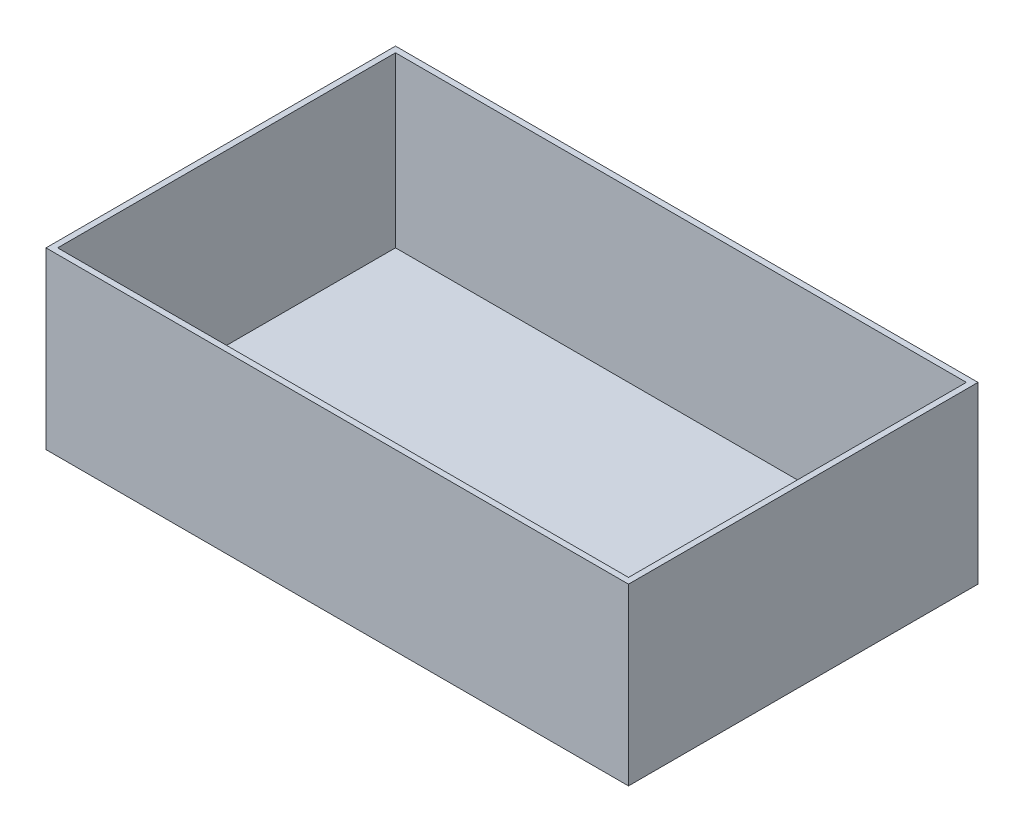
ISO-10303-21;
HEADER;
FILE_DESCRIPTION(('STEP AP214'),'2;1');
FILE_NAME('part.step','',(''),(''),'','','');
FILE_SCHEMA(('AUTOMOTIVE_DESIGN { 1 0 10303 214 1 1 1 1 }'));
ENDSEC;
DATA;
#1=APPLICATION_CONTEXT('core data for automotive mechanical design processes');
#2=APPLICATION_PROTOCOL_DEFINITION('international standard','automotive_design',2000,#1);
#3=PRODUCT_CONTEXT('',#1,'mechanical');
#4=PRODUCT('Part','Part','',(#3));
#5=PRODUCT_RELATED_PRODUCT_CATEGORY('part','',(#4));
#6=PRODUCT_DEFINITION_FORMATION('','',#4);
#7=PRODUCT_DEFINITION_CONTEXT('part definition',#1,'design');
#8=PRODUCT_DEFINITION('design','',#6,#7);
#9=PRODUCT_DEFINITION_SHAPE('','',#8);
#10=(LENGTH_UNIT() NAMED_UNIT(*) SI_UNIT(.MILLI.,.METRE.));
#11=(NAMED_UNIT(*) PLANE_ANGLE_UNIT() SI_UNIT($,.RADIAN.));
#12=(NAMED_UNIT(*) SI_UNIT($,.STERADIAN.) SOLID_ANGLE_UNIT());
#13=UNCERTAINTY_MEASURE_WITH_UNIT(LENGTH_MEASURE(1.E-05),#10,'distance_accuracy_value','');
#14=(GEOMETRIC_REPRESENTATION_CONTEXT(3) GLOBAL_UNCERTAINTY_ASSIGNED_CONTEXT((#13)) GLOBAL_UNIT_ASSIGNED_CONTEXT((#10,
#11,#12)) REPRESENTATION_CONTEXT('',''));
#15=CARTESIAN_POINT('',(0.,0.,0.));
#16=DIRECTION('',(0.,0.,1.));
#17=DIRECTION('',(1.,0.,0.));
#18=AXIS2_PLACEMENT_3D('',#15,#16,#17);
#19=CARTESIAN_POINT('',(250.,5.,150.));
#20=DIRECTION('',(-1.,0.,0.));
#21=DIRECTION('',(0.,0.,1.));
#22=AXIS2_PLACEMENT_3D('',#19,#20,#21);
#23=PLANE('',#22);
#24=DIRECTION('',(0.,0.,-1.));
#25=VECTOR('',#24,1.);
#26=CARTESIAN_POINT('',(250.,0.,150.));
#27=LINE('',#26,#25);
#28=CARTESIAN_POINT('',(250.,0.,150.));
#29=VERTEX_POINT('',#28);
#30=CARTESIAN_POINT('',(250.,0.,-150.));
#31=VERTEX_POINT('',#30);
#32=EDGE_CURVE('E173',#29,#31,#27,.T.);
#33=ORIENTED_EDGE('',*,*,#32,.T.);
#34=DIRECTION('',(0.,-1.,0.));
#35=VECTOR('',#34,1.);
#36=CARTESIAN_POINT('',(250.,5.,-150.));
#37=LINE('',#36,#35);
#38=CARTESIAN_POINT('',(250.,150.,-150.));
#39=VERTEX_POINT('',#38);
#40=EDGE_CURVE('E11',#39,#31,#37,.T.);
#41=ORIENTED_EDGE('',*,*,#40,.F.);
#42=DIRECTION('',(0.,0.,-1.));
#43=VECTOR('',#42,1.);
#44=CARTESIAN_POINT('',(250.,150.,150.));
#45=LINE('',#44,#43);
#46=CARTESIAN_POINT('',(250.,150.,150.));
#47=VERTEX_POINT('',#46);
#48=EDGE_CURVE('E161',#47,#39,#45,.T.);
#49=ORIENTED_EDGE('',*,*,#48,.F.);
#50=DIRECTION('',(0.,-1.,0.));
#51=VECTOR('',#50,1.);
#52=CARTESIAN_POINT('',(250.,5.,150.));
#53=LINE('',#52,#51);
#54=EDGE_CURVE('E185',#47,#29,#53,.T.);
#55=ORIENTED_EDGE('',*,*,#54,.T.);
#56=EDGE_LOOP('',(#33,#41,#49,#55));
#57=FACE_BOUND('',#56,.T.);
#58=ADVANCED_FACE('F39',(#57),#23,.F.);
#59=CARTESIAN_POINT('',(-250.,5.,-150.));
#60=DIRECTION('',(0.,0.,1.));
#61=DIRECTION('',(1.,0.,0.));
#62=AXIS2_PLACEMENT_3D('',#59,#60,#61);
#63=PLANE('',#62);
#64=DIRECTION('',(-1.,0.,0.));
#65=VECTOR('',#64,1.);
#66=CARTESIAN_POINT('',(-250.,0.,-150.));
#67=LINE('',#66,#65);
#68=CARTESIAN_POINT('',(-250.,0.,-150.));
#69=VERTEX_POINT('',#68);
#70=EDGE_CURVE('E177',#31,#69,#67,.T.);
#71=ORIENTED_EDGE('',*,*,#70,.T.);
#72=DIRECTION('',(0.,-1.,0.));
#73=VECTOR('',#72,1.);
#74=CARTESIAN_POINT('',(-250.,5.,-150.));
#75=LINE('',#74,#73);
#76=CARTESIAN_POINT('',(-250.,150.,-150.));
#77=VERTEX_POINT('',#76);
#78=EDGE_CURVE('E47',#77,#69,#75,.T.);
#79=ORIENTED_EDGE('',*,*,#78,.F.);
#80=DIRECTION('',(-1.,0.,0.));
#81=VECTOR('',#80,1.);
#82=CARTESIAN_POINT('',(250.,150.,-150.));
#83=LINE('',#82,#81);
#84=EDGE_CURVE('E165',#39,#77,#83,.T.);
#85=ORIENTED_EDGE('',*,*,#84,.F.);
#86=ORIENTED_EDGE('',*,*,#40,.T.);
#87=EDGE_LOOP('',(#71,#79,#85,#86));
#88=FACE_BOUND('',#87,.T.);
#89=ADVANCED_FACE('F206',(#88),#63,.F.);
#90=CARTESIAN_POINT('',(-250.,5.,150.));
#91=DIRECTION('',(1.,0.,0.));
#92=DIRECTION('',(0.,0.,-1.));
#93=AXIS2_PLACEMENT_3D('',#90,#91,#92);
#94=PLANE('',#93);
#95=DIRECTION('',(0.,0.,1.));
#96=VECTOR('',#95,1.);
#97=CARTESIAN_POINT('',(-250.,0.,150.));
#98=LINE('',#97,#96);
#99=CARTESIAN_POINT('',(-250.,0.,150.));
#100=VERTEX_POINT('',#99);
#101=EDGE_CURVE('E180',#69,#100,#98,.T.);
#102=ORIENTED_EDGE('',*,*,#101,.T.);
#103=DIRECTION('',(0.,-1.,0.));
#104=VECTOR('',#103,1.);
#105=CARTESIAN_POINT('',(-250.,5.,150.));
#106=LINE('',#105,#104);
#107=CARTESIAN_POINT('',(-250.,150.,150.));
#108=VERTEX_POINT('',#107);
#109=EDGE_CURVE('E188',#108,#100,#106,.T.);
#110=ORIENTED_EDGE('',*,*,#109,.F.);
#111=DIRECTION('',(0.,0.,1.));
#112=VECTOR('',#111,1.);
#113=CARTESIAN_POINT('',(-250.,150.,-150.));
#114=LINE('',#113,#112);
#115=EDGE_CURVE('E169',#77,#108,#114,.T.);
#116=ORIENTED_EDGE('',*,*,#115,.F.);
#117=ORIENTED_EDGE('',*,*,#78,.T.);
#118=EDGE_LOOP('',(#102,#110,#116,#117));
#119=FACE_BOUND('',#118,.T.);
#120=ADVANCED_FACE('F195',(#119),#94,.F.);
#121=CARTESIAN_POINT('',(-250.,5.,150.));
#122=DIRECTION('',(0.,0.,-1.));
#123=DIRECTION('',(-1.,0.,0.));
#124=AXIS2_PLACEMENT_3D('',#121,#122,#123);
#125=PLANE('',#124);
#126=DIRECTION('',(1.,0.,0.));
#127=VECTOR('',#126,1.);
#128=CARTESIAN_POINT('',(-250.,0.,150.));
#129=LINE('',#128,#127);
#130=EDGE_CURVE('E62',#100,#29,#129,.T.);
#131=ORIENTED_EDGE('',*,*,#130,.T.);
#132=ORIENTED_EDGE('',*,*,#54,.F.);
#133=DIRECTION('',(1.,0.,0.));
#134=VECTOR('',#133,1.);
#135=CARTESIAN_POINT('',(-250.,150.,150.));
#136=LINE('',#135,#134);
#137=EDGE_CURVE('E124',#108,#47,#136,.T.);
#138=ORIENTED_EDGE('',*,*,#137,.F.);
#139=ORIENTED_EDGE('',*,*,#109,.T.);
#140=EDGE_LOOP('',(#131,#132,#138,#139));
#141=FACE_BOUND('',#140,.T.);
#142=ADVANCED_FACE('F204',(#141),#125,.F.);
#143=CARTESIAN_POINT('',(0.,0.,0.));
#144=DIRECTION('',(0.,-1.,0.));
#145=DIRECTION('',(0.,0.,-1.));
#146=AXIS2_PLACEMENT_3D('',#143,#144,#145);
#147=PLANE('',#146);
#148=ORIENTED_EDGE('',*,*,#32,.F.);
#149=ORIENTED_EDGE('',*,*,#130,.F.);
#150=ORIENTED_EDGE('',*,*,#101,.F.);
#151=ORIENTED_EDGE('',*,*,#70,.F.);
#152=EDGE_LOOP('',(#148,#149,#150,#151));
#153=FACE_BOUND('',#152,.T.);
#154=ADVANCED_FACE('F200',(#153),#147,.T.);
#155=CARTESIAN_POINT('',(0.,150.,0.));
#156=DIRECTION('',(0.,1.,0.));
#157=DIRECTION('',(0.,0.,1.));
#158=AXIS2_PLACEMENT_3D('',#155,#156,#157);
#159=PLANE('',#158);
#160=ORIENTED_EDGE('',*,*,#137,.T.);
#161=ORIENTED_EDGE('',*,*,#48,.T.);
#162=ORIENTED_EDGE('',*,*,#84,.T.);
#163=ORIENTED_EDGE('',*,*,#115,.T.);
#164=EDGE_LOOP('',(#160,#161,#162,#163));
#165=FACE_BOUND('',#164,.T.);
#166=DIRECTION('',(0.,0.,-1.));
#167=VECTOR('',#166,1.);
#168=CARTESIAN_POINT('',(245.,150.,145.));
#169=LINE('',#168,#167);
#170=CARTESIAN_POINT('',(245.,150.,145.));
#171=VERTEX_POINT('',#170);
#172=CARTESIAN_POINT('',(245.,150.,-145.));
#173=VERTEX_POINT('',#172);
#174=EDGE_CURVE('E115',#171,#173,#169,.T.);
#175=ORIENTED_EDGE('',*,*,#174,.F.);
#176=DIRECTION('',(1.,0.,0.));
#177=VECTOR('',#176,1.);
#178=CARTESIAN_POINT('',(-245.,150.,145.));
#179=LINE('',#178,#177);
#180=CARTESIAN_POINT('',(-245.,150.,145.));
#181=VERTEX_POINT('',#180);
#182=EDGE_CURVE('E106',#181,#171,#179,.T.);
#183=ORIENTED_EDGE('',*,*,#182,.F.);
#184=DIRECTION('',(0.,0.,1.));
#185=VECTOR('',#184,1.);
#186=CARTESIAN_POINT('',(-245.,150.,-145.));
#187=LINE('',#186,#185);
#188=CARTESIAN_POINT('',(-245.,150.,-145.));
#189=VERTEX_POINT('',#188);
#190=EDGE_CURVE('E134',#189,#181,#187,.T.);
#191=ORIENTED_EDGE('',*,*,#190,.F.);
#192=DIRECTION('',(-1.,0.,0.));
#193=VECTOR('',#192,1.);
#194=CARTESIAN_POINT('',(245.,150.,-145.));
#195=LINE('',#194,#193);
#196=EDGE_CURVE('E130',#173,#189,#195,.T.);
#197=ORIENTED_EDGE('',*,*,#196,.F.);
#198=EDGE_LOOP('',(#175,#183,#191,#197));
#199=FACE_BOUND('',#198,.T.);
#200=ADVANCED_FACE('F128',(#165,#199),#159,.T.);
#201=CARTESIAN_POINT('',(-245.,150.,145.));
#202=DIRECTION('',(0.,0.,-1.));
#203=DIRECTION('',(-1.,0.,0.));
#204=AXIS2_PLACEMENT_3D('',#201,#202,#203);
#205=PLANE('',#204);
#206=DIRECTION('',(1.,0.,0.));
#207=VECTOR('',#206,1.);
#208=CARTESIAN_POINT('',(-245.,5.,145.));
#209=LINE('',#208,#207);
#210=CARTESIAN_POINT('',(-245.,5.,145.));
#211=VERTEX_POINT('',#210);
#212=CARTESIAN_POINT('',(245.,5.,145.));
#213=VERTEX_POINT('',#212);
#214=EDGE_CURVE('E139',#211,#213,#209,.T.);
#215=ORIENTED_EDGE('',*,*,#214,.F.);
#216=DIRECTION('',(0.,-1.,0.));
#217=VECTOR('',#216,1.);
#218=CARTESIAN_POINT('',(-245.,150.,145.));
#219=LINE('',#218,#217);
#220=EDGE_CURVE('E54',#181,#211,#219,.T.);
#221=ORIENTED_EDGE('',*,*,#220,.F.);
#222=ORIENTED_EDGE('',*,*,#182,.T.);
#223=DIRECTION('',(0.,-1.,0.));
#224=VECTOR('',#223,1.);
#225=CARTESIAN_POINT('',(245.,150.,145.));
#226=LINE('',#225,#224);
#227=EDGE_CURVE('E109',#171,#213,#226,.T.);
#228=ORIENTED_EDGE('',*,*,#227,.T.);
#229=EDGE_LOOP('',(#215,#221,#222,#228));
#230=FACE_BOUND('',#229,.T.);
#231=ADVANCED_FACE('F108',(#230),#205,.T.);
#232=CARTESIAN_POINT('',(245.,150.,145.));
#233=DIRECTION('',(-1.,0.,0.));
#234=DIRECTION('',(0.,0.,1.));
#235=AXIS2_PLACEMENT_3D('',#232,#233,#234);
#236=PLANE('',#235);
#237=DIRECTION('',(0.,0.,-1.));
#238=VECTOR('',#237,1.);
#239=CARTESIAN_POINT('',(245.,5.,145.));
#240=LINE('',#239,#238);
#241=CARTESIAN_POINT('',(245.,5.,-145.));
#242=VERTEX_POINT('',#241);
#243=EDGE_CURVE('E122',#213,#242,#240,.T.);
#244=ORIENTED_EDGE('',*,*,#243,.F.);
#245=ORIENTED_EDGE('',*,*,#227,.F.);
#246=ORIENTED_EDGE('',*,*,#174,.T.);
#247=DIRECTION('',(0.,-1.,0.));
#248=VECTOR('',#247,1.);
#249=CARTESIAN_POINT('',(245.,150.,-145.));
#250=LINE('',#249,#248);
#251=EDGE_CURVE('E125',#173,#242,#250,.T.);
#252=ORIENTED_EDGE('',*,*,#251,.T.);
#253=EDGE_LOOP('',(#244,#245,#246,#252));
#254=FACE_BOUND('',#253,.T.);
#255=ADVANCED_FACE('F119',(#254),#236,.T.);
#256=CARTESIAN_POINT('',(245.,150.,-145.));
#257=DIRECTION('',(0.,0.,1.));
#258=DIRECTION('',(1.,0.,0.));
#259=AXIS2_PLACEMENT_3D('',#256,#257,#258);
#260=PLANE('',#259);
#261=DIRECTION('',(-1.,0.,0.));
#262=VECTOR('',#261,1.);
#263=CARTESIAN_POINT('',(245.,5.,-145.));
#264=LINE('',#263,#262);
#265=CARTESIAN_POINT('',(-245.,5.,-145.));
#266=VERTEX_POINT('',#265);
#267=EDGE_CURVE('E144',#242,#266,#264,.T.);
#268=ORIENTED_EDGE('',*,*,#267,.F.);
#269=ORIENTED_EDGE('',*,*,#251,.F.);
#270=ORIENTED_EDGE('',*,*,#196,.T.);
#271=DIRECTION('',(0.,-1.,0.));
#272=VECTOR('',#271,1.);
#273=CARTESIAN_POINT('',(-245.,150.,-145.));
#274=LINE('',#273,#272);
#275=EDGE_CURVE('E153',#189,#266,#274,.T.);
#276=ORIENTED_EDGE('',*,*,#275,.T.);
#277=EDGE_LOOP('',(#268,#269,#270,#276));
#278=FACE_BOUND('',#277,.T.);
#279=ADVANCED_FACE('F229',(#278),#260,.T.);
#280=CARTESIAN_POINT('',(-245.,150.,-145.));
#281=DIRECTION('',(1.,0.,0.));
#282=DIRECTION('',(0.,0.,-1.));
#283=AXIS2_PLACEMENT_3D('',#280,#281,#282);
#284=PLANE('',#283);
#285=DIRECTION('',(0.,0.,1.));
#286=VECTOR('',#285,1.);
#287=CARTESIAN_POINT('',(-245.,5.,-145.));
#288=LINE('',#287,#286);
#289=EDGE_CURVE('E116',#266,#211,#288,.T.);
#290=ORIENTED_EDGE('',*,*,#289,.F.);
#291=ORIENTED_EDGE('',*,*,#275,.F.);
#292=ORIENTED_EDGE('',*,*,#190,.T.);
#293=ORIENTED_EDGE('',*,*,#220,.T.);
#294=EDGE_LOOP('',(#290,#291,#292,#293));
#295=FACE_BOUND('',#294,.T.);
#296=ADVANCED_FACE('F221',(#295),#284,.T.);
#297=CARTESIAN_POINT('',(0.,5.,0.));
#298=DIRECTION('',(0.,-1.,0.));
#299=DIRECTION('',(0.,0.,-1.));
#300=AXIS2_PLACEMENT_3D('',#297,#298,#299);
#301=PLANE('',#300);
#302=ORIENTED_EDGE('',*,*,#289,.T.);
#303=ORIENTED_EDGE('',*,*,#214,.T.);
#304=ORIENTED_EDGE('',*,*,#243,.T.);
#305=ORIENTED_EDGE('',*,*,#267,.T.);
#306=EDGE_LOOP('',(#302,#303,#304,#305));
#307=FACE_BOUND('',#306,.T.);
#308=ADVANCED_FACE('F218',(#307),#301,.F.);
#309=CLOSED_SHELL('',(#58,#89,#120,#142,#154,#200,#231,#255,#279,#296,#308));
#310=MANIFOLD_SOLID_BREP('B2',#309);
#311=ADVANCED_BREP_SHAPE_REPRESENTATION('',(#18,#310),#14);
#312=SHAPE_DEFINITION_REPRESENTATION(#9,#311);
ENDSEC;
END-ISO-10303-21;
